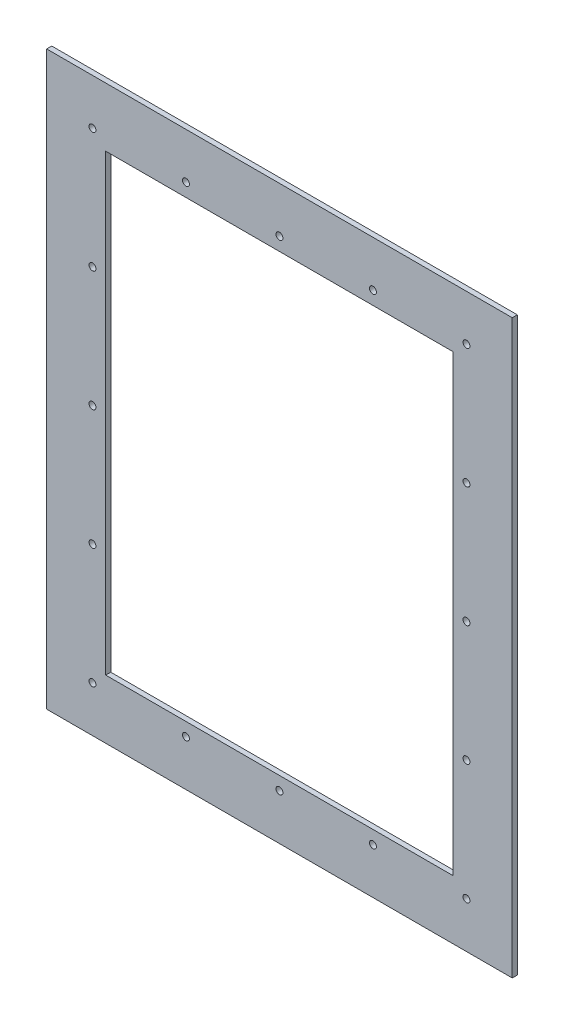
ISO-10303-21;
HEADER;
FILE_DESCRIPTION(('STEP AP214'),'2;1');
FILE_NAME('part.step','',(''),(''),'','','');
FILE_SCHEMA(('AUTOMOTIVE_DESIGN { 1 0 10303 214 1 1 1 1 }'));
ENDSEC;
DATA;
#1=APPLICATION_CONTEXT('core data for automotive mechanical design processes');
#2=APPLICATION_PROTOCOL_DEFINITION('international standard','automotive_design',2000,#1);
#3=PRODUCT_CONTEXT('',#1,'mechanical');
#4=PRODUCT('Part','Part','',(#3));
#5=PRODUCT_RELATED_PRODUCT_CATEGORY('part','',(#4));
#6=PRODUCT_DEFINITION_FORMATION('','',#4);
#7=PRODUCT_DEFINITION_CONTEXT('part definition',#1,'design');
#8=PRODUCT_DEFINITION('design','',#6,#7);
#9=PRODUCT_DEFINITION_SHAPE('','',#8);
#10=(LENGTH_UNIT() NAMED_UNIT(*) SI_UNIT(.MILLI.,.METRE.));
#11=(NAMED_UNIT(*) PLANE_ANGLE_UNIT() SI_UNIT($,.RADIAN.));
#12=(NAMED_UNIT(*) SI_UNIT($,.STERADIAN.) SOLID_ANGLE_UNIT());
#13=UNCERTAINTY_MEASURE_WITH_UNIT(LENGTH_MEASURE(1.E-05),#10,'distance_accuracy_value','');
#14=(GEOMETRIC_REPRESENTATION_CONTEXT(3) GLOBAL_UNCERTAINTY_ASSIGNED_CONTEXT((#13)) GLOBAL_UNIT_ASSIGNED_CONTEXT((#10,
#11,#12)) REPRESENTATION_CONTEXT('',''));
#15=CARTESIAN_POINT('',(0.,0.,0.));
#16=DIRECTION('',(0.,0.,1.));
#17=DIRECTION('',(1.,0.,0.));
#18=AXIS2_PLACEMENT_3D('',#15,#16,#17);
#19=CARTESIAN_POINT('',(0.,0.,3.));
#20=DIRECTION('',(0.,0.,1.));
#21=DIRECTION('',(1.,0.,0.));
#22=AXIS2_PLACEMENT_3D('',#19,#20,#21);
#23=PLANE('',#22);
#24=CARTESIAN_POINT('',(0.,-142.360879206864,3.));
#25=DIRECTION('',(0.,0.,1.));
#26=DIRECTION('',(-1.,0.,0.));
#27=AXIS2_PLACEMENT_3D('',#24,#25,#26);
#28=CIRCLE('',#27,2.05);
#29=CARTESIAN_POINT('',(-2.04999999999996,-142.360879206864,3.));
#30=VERTEX_POINT('',#29);
#31=EDGE_CURVE('E299',#30,#30,#28,.T.);
#32=ORIENTED_EDGE('',*,*,#31,.F.);
#33=EDGE_LOOP('',(#32));
#34=FACE_BOUND('',#33,.T.);
#35=CARTESIAN_POINT('',(110.860879206864,-71.1804396034318,3.));
#36=DIRECTION('',(0.,0.,1.));
#37=DIRECTION('',(1.,0.,0.));
#38=AXIS2_PLACEMENT_3D('',#35,#36,#37);
#39=CIRCLE('',#38,2.0499999999998);
#40=CARTESIAN_POINT('',(112.910879206864,-71.1804396034318,3.));
#41=VERTEX_POINT('',#40);
#42=EDGE_CURVE('E311',#41,#41,#39,.T.);
#43=ORIENTED_EDGE('',*,*,#42,.F.);
#44=EDGE_LOOP('',(#43));
#45=FACE_BOUND('',#44,.T.);
#46=CARTESIAN_POINT('',(55.4304396034319,-142.360879206864,3.));
#47=DIRECTION('',(0.,0.,1.));
#48=DIRECTION('',(1.,0.,0.));
#49=AXIS2_PLACEMENT_3D('',#46,#47,#48);
#50=CIRCLE('',#49,2.05000000000001);
#51=CARTESIAN_POINT('',(57.4804396034319,-142.360879206864,3.));
#52=VERTEX_POINT('',#51);
#53=EDGE_CURVE('E323',#52,#52,#50,.T.);
#54=ORIENTED_EDGE('',*,*,#53,.F.);
#55=EDGE_LOOP('',(#54));
#56=FACE_BOUND('',#55,.T.);
#57=CARTESIAN_POINT('',(110.860879206864,142.360879206864,3.));
#58=DIRECTION('',(0.,0.,1.));
#59=DIRECTION('',(-1.,0.,0.));
#60=AXIS2_PLACEMENT_3D('',#57,#58,#59);
#61=CIRCLE('',#60,2.0499999999998);
#62=CARTESIAN_POINT('',(108.810879206864,142.360879206864,3.));
#63=VERTEX_POINT('',#62);
#64=EDGE_CURVE('E335',#63,#63,#61,.T.);
#65=ORIENTED_EDGE('',*,*,#64,.F.);
#66=EDGE_LOOP('',(#65));
#67=FACE_BOUND('',#66,.T.);
#68=CARTESIAN_POINT('',(110.860879206864,0.,3.));
#69=DIRECTION('',(0.,0.,1.));
#70=DIRECTION('',(-1.,0.,0.));
#71=AXIS2_PLACEMENT_3D('',#68,#69,#70);
#72=CIRCLE('',#71,2.0499999999998);
#73=CARTESIAN_POINT('',(108.810879206864,0.,3.));
#74=VERTEX_POINT('',#73);
#75=EDGE_CURVE('E347',#74,#74,#72,.T.);
#76=ORIENTED_EDGE('',*,*,#75,.F.);
#77=EDGE_LOOP('',(#76));
#78=FACE_BOUND('',#77,.T.);
#79=CARTESIAN_POINT('',(-110.860879206864,-142.360879206864,3.));
#80=DIRECTION('',(0.,0.,1.));
#81=DIRECTION('',(-1.,0.,0.));
#82=AXIS2_PLACEMENT_3D('',#79,#80,#81);
#83=CIRCLE('',#82,2.0499999999998);
#84=CARTESIAN_POINT('',(-112.910879206863,-142.360879206864,3.));
#85=VERTEX_POINT('',#84);
#86=EDGE_CURVE('E359',#85,#85,#83,.T.);
#87=ORIENTED_EDGE('',*,*,#86,.F.);
#88=EDGE_LOOP('',(#87));
#89=FACE_BOUND('',#88,.T.);
#90=CARTESIAN_POINT('',(-110.860879206864,71.1804396034319,3.));
#91=DIRECTION('',(0.,0.,1.));
#92=DIRECTION('',(1.,0.,0.));
#93=AXIS2_PLACEMENT_3D('',#90,#91,#92);
#94=CIRCLE('',#93,2.0499999999998);
#95=CARTESIAN_POINT('',(-108.810879206864,71.1804396034319,3.));
#96=VERTEX_POINT('',#95);
#97=EDGE_CURVE('E371',#96,#96,#94,.T.);
#98=ORIENTED_EDGE('',*,*,#97,.F.);
#99=EDGE_LOOP('',(#98));
#100=FACE_BOUND('',#99,.T.);
#101=CARTESIAN_POINT('',(-110.860879206864,142.360879206864,3.));
#102=DIRECTION('',(0.,0.,1.));
#103=DIRECTION('',(1.,0.,0.));
#104=AXIS2_PLACEMENT_3D('',#101,#102,#103);
#105=CIRCLE('',#104,2.0499999999998);
#106=CARTESIAN_POINT('',(-108.810879206864,142.360879206864,3.));
#107=VERTEX_POINT('',#106);
#108=EDGE_CURVE('E133',#107,#107,#105,.T.);
#109=ORIENTED_EDGE('',*,*,#108,.F.);
#110=EDGE_LOOP('',(#109));
#111=FACE_BOUND('',#110,.T.);
#112=DIRECTION('',(0.,-1.,0.));
#113=VECTOR('',#112,1.);
#114=CARTESIAN_POINT('',(-138.,169.5,3.));
#115=LINE('',#114,#113);
#116=CARTESIAN_POINT('',(-138.,169.5,3.));
#117=VERTEX_POINT('',#116);
#118=CARTESIAN_POINT('',(-138.,-169.5,3.));
#119=VERTEX_POINT('',#118);
#120=EDGE_CURVE('E143',#117,#119,#115,.T.);
#121=ORIENTED_EDGE('',*,*,#120,.T.);
#122=DIRECTION('',(1.,0.,0.));
#123=VECTOR('',#122,1.);
#124=CARTESIAN_POINT('',(-138.,-169.5,3.));
#125=LINE('',#124,#123);
#126=CARTESIAN_POINT('',(138.,-169.5,3.));
#127=VERTEX_POINT('',#126);
#128=EDGE_CURVE('E146',#119,#127,#125,.T.);
#129=ORIENTED_EDGE('',*,*,#128,.T.);
#130=DIRECTION('',(0.,1.,0.));
#131=VECTOR('',#130,1.);
#132=CARTESIAN_POINT('',(138.,169.5,3.));
#133=LINE('',#132,#131);
#134=CARTESIAN_POINT('',(138.,169.5,3.));
#135=VERTEX_POINT('',#134);
#136=EDGE_CURVE('E149',#127,#135,#133,.T.);
#137=ORIENTED_EDGE('',*,*,#136,.T.);
#138=DIRECTION('',(-1.,0.,0.));
#139=VECTOR('',#138,1.);
#140=CARTESIAN_POINT('',(-138.,169.5,3.));
#141=LINE('',#140,#139);
#142=EDGE_CURVE('E151',#135,#117,#141,.T.);
#143=ORIENTED_EDGE('',*,*,#142,.T.);
#144=EDGE_LOOP('',(#121,#129,#137,#143));
#145=FACE_BOUND('',#144,.T.);
#146=DIRECTION('',(1.,0.,0.));
#147=VECTOR('',#146,1.);
#148=CARTESIAN_POINT('',(-103.,-134.5,3.));
#149=LINE('',#148,#147);
#150=CARTESIAN_POINT('',(-103.,-134.5,3.));
#151=VERTEX_POINT('',#150);
#152=CARTESIAN_POINT('',(103.,-134.5,3.));
#153=VERTEX_POINT('',#152);
#154=EDGE_CURVE('E112',#151,#153,#149,.T.);
#155=ORIENTED_EDGE('',*,*,#154,.F.);
#156=DIRECTION('',(0.,-1.,0.));
#157=VECTOR('',#156,1.);
#158=CARTESIAN_POINT('',(-103.,134.5,3.));
#159=LINE('',#158,#157);
#160=CARTESIAN_POINT('',(-103.,134.5,3.));
#161=VERTEX_POINT('',#160);
#162=EDGE_CURVE('E104',#161,#151,#159,.T.);
#163=ORIENTED_EDGE('',*,*,#162,.F.);
#164=DIRECTION('',(-1.,0.,0.));
#165=VECTOR('',#164,1.);
#166=CARTESIAN_POINT('',(-103.,134.5,3.));
#167=LINE('',#166,#165);
#168=CARTESIAN_POINT('',(103.,134.5,3.));
#169=VERTEX_POINT('',#168);
#170=EDGE_CURVE('E127',#169,#161,#167,.T.);
#171=ORIENTED_EDGE('',*,*,#170,.F.);
#172=DIRECTION('',(0.,1.,0.));
#173=VECTOR('',#172,1.);
#174=CARTESIAN_POINT('',(103.,134.5,3.));
#175=LINE('',#174,#173);
#176=EDGE_CURVE('E125',#153,#169,#175,.T.);
#177=ORIENTED_EDGE('',*,*,#176,.F.);
#178=EDGE_LOOP('',(#155,#163,#171,#177));
#179=FACE_BOUND('',#178,.T.);
#180=CARTESIAN_POINT('',(-55.4304396034318,142.360879206864,3.));
#181=DIRECTION('',(0.,0.,1.));
#182=DIRECTION('',(1.,0.,0.));
#183=AXIS2_PLACEMENT_3D('',#180,#181,#182);
#184=CIRCLE('',#183,2.05000000000001);
#185=CARTESIAN_POINT('',(-53.3804396034317,142.360879206864,3.));
#186=VERTEX_POINT('',#185);
#187=EDGE_CURVE('E377',#186,#186,#184,.T.);
#188=ORIENTED_EDGE('',*,*,#187,.F.);
#189=EDGE_LOOP('',(#188));
#190=FACE_BOUND('',#189,.T.);
#191=CARTESIAN_POINT('',(-55.4304396034317,-142.360879206864,3.));
#192=DIRECTION('',(0.,0.,1.));
#193=DIRECTION('',(-1.,0.,0.));
#194=AXIS2_PLACEMENT_3D('',#191,#192,#193);
#195=CIRCLE('',#194,2.05000000000001);
#196=CARTESIAN_POINT('',(-57.4804396034317,-142.360879206864,3.));
#197=VERTEX_POINT('',#196);
#198=EDGE_CURVE('E365',#197,#197,#195,.T.);
#199=ORIENTED_EDGE('',*,*,#198,.F.);
#200=EDGE_LOOP('',(#199));
#201=FACE_BOUND('',#200,.T.);
#202=CARTESIAN_POINT('',(-110.860879206864,-71.1804396034318,3.));
#203=DIRECTION('',(0.,0.,1.));
#204=DIRECTION('',(-1.,0.,0.));
#205=AXIS2_PLACEMENT_3D('',#202,#203,#204);
#206=CIRCLE('',#205,2.0499999999998);
#207=CARTESIAN_POINT('',(-112.910879206863,-71.1804396034318,3.));
#208=VERTEX_POINT('',#207);
#209=EDGE_CURVE('E353',#208,#208,#206,.T.);
#210=ORIENTED_EDGE('',*,*,#209,.F.);
#211=EDGE_LOOP('',(#210));
#212=FACE_BOUND('',#211,.T.);
#213=CARTESIAN_POINT('',(55.430439603432,142.360879206864,3.));
#214=DIRECTION('',(0.,0.,1.));
#215=DIRECTION('',(-1.,0.,0.));
#216=AXIS2_PLACEMENT_3D('',#213,#214,#215);
#217=CIRCLE('',#216,2.05000000000001);
#218=CARTESIAN_POINT('',(53.380439603432,142.360879206864,3.));
#219=VERTEX_POINT('',#218);
#220=EDGE_CURVE('E341',#219,#219,#217,.T.);
#221=ORIENTED_EDGE('',*,*,#220,.F.);
#222=EDGE_LOOP('',(#221));
#223=FACE_BOUND('',#222,.T.);
#224=CARTESIAN_POINT('',(110.860879206864,71.1804396034319,3.));
#225=DIRECTION('',(0.,0.,1.));
#226=DIRECTION('',(-1.,0.,0.));
#227=AXIS2_PLACEMENT_3D('',#224,#225,#226);
#228=CIRCLE('',#227,2.0499999999998);
#229=CARTESIAN_POINT('',(108.810879206864,71.1804396034319,3.));
#230=VERTEX_POINT('',#229);
#231=EDGE_CURVE('E329',#230,#230,#228,.T.);
#232=ORIENTED_EDGE('',*,*,#231,.F.);
#233=EDGE_LOOP('',(#232));
#234=FACE_BOUND('',#233,.T.);
#235=CARTESIAN_POINT('',(110.860879206864,-142.360879206864,3.));
#236=DIRECTION('',(0.,0.,1.));
#237=DIRECTION('',(1.,0.,0.));
#238=AXIS2_PLACEMENT_3D('',#235,#236,#237);
#239=CIRCLE('',#238,2.0499999999998);
#240=CARTESIAN_POINT('',(112.910879206864,-142.360879206864,3.));
#241=VERTEX_POINT('',#240);
#242=EDGE_CURVE('E317',#241,#241,#239,.T.);
#243=ORIENTED_EDGE('',*,*,#242,.F.);
#244=EDGE_LOOP('',(#243));
#245=FACE_BOUND('',#244,.T.);
#246=CARTESIAN_POINT('',(-110.860879206864,0.,3.));
#247=DIRECTION('',(0.,0.,1.));
#248=DIRECTION('',(1.,0.,0.));
#249=AXIS2_PLACEMENT_3D('',#246,#247,#248);
#250=CIRCLE('',#249,2.0499999999998);
#251=CARTESIAN_POINT('',(-108.810879206864,0.,3.));
#252=VERTEX_POINT('',#251);
#253=EDGE_CURVE('E305',#252,#252,#250,.T.);
#254=ORIENTED_EDGE('',*,*,#253,.F.);
#255=EDGE_LOOP('',(#254));
#256=FACE_BOUND('',#255,.T.);
#257=CARTESIAN_POINT('',(0.,142.360879206864,3.));
#258=DIRECTION('',(0.,0.,1.));
#259=DIRECTION('',(1.,0.,0.));
#260=AXIS2_PLACEMENT_3D('',#257,#258,#259);
#261=CIRCLE('',#260,2.05);
#262=CARTESIAN_POINT('',(2.05,142.360879206864,3.));
#263=VERTEX_POINT('',#262);
#264=EDGE_CURVE('E290',#263,#263,#261,.T.);
#265=ORIENTED_EDGE('',*,*,#264,.F.);
#266=EDGE_LOOP('',(#265));
#267=FACE_BOUND('',#266,.T.);
#268=ADVANCED_FACE('F39',(#34,#45,#56,#67,#78,#89,#100,#111,#145,#179,#190,#201,#212,#223,#234,
#245,#256,#267),#23,.T.);
#269=CARTESIAN_POINT('',(0.,0.,0.));
#270=DIRECTION('',(0.,0.,1.));
#271=DIRECTION('',(1.,0.,0.));
#272=AXIS2_PLACEMENT_3D('',#269,#270,#271);
#273=PLANE('',#272);
#274=DIRECTION('',(0.,-1.,0.));
#275=VECTOR('',#274,1.);
#276=CARTESIAN_POINT('',(-138.,169.5,0.));
#277=LINE('',#276,#275);
#278=CARTESIAN_POINT('',(-138.,169.5,0.));
#279=VERTEX_POINT('',#278);
#280=CARTESIAN_POINT('',(-138.,-169.5,0.));
#281=VERTEX_POINT('',#280);
#282=EDGE_CURVE('E120',#279,#281,#277,.T.);
#283=ORIENTED_EDGE('',*,*,#282,.F.);
#284=DIRECTION('',(-1.,0.,0.));
#285=VECTOR('',#284,1.);
#286=CARTESIAN_POINT('',(-138.,169.5,0.));
#287=LINE('',#286,#285);
#288=CARTESIAN_POINT('',(138.,169.5,0.));
#289=VERTEX_POINT('',#288);
#290=EDGE_CURVE('E147',#289,#279,#287,.T.);
#291=ORIENTED_EDGE('',*,*,#290,.F.);
#292=DIRECTION('',(0.,1.,0.));
#293=VECTOR('',#292,1.);
#294=CARTESIAN_POINT('',(138.,169.5,0.));
#295=LINE('',#294,#293);
#296=CARTESIAN_POINT('',(138.,-169.5,0.));
#297=VERTEX_POINT('',#296);
#298=EDGE_CURVE('E158',#297,#289,#295,.T.);
#299=ORIENTED_EDGE('',*,*,#298,.F.);
#300=DIRECTION('',(1.,0.,0.));
#301=VECTOR('',#300,1.);
#302=CARTESIAN_POINT('',(-138.,-169.5,0.));
#303=LINE('',#302,#301);
#304=EDGE_CURVE('E156',#281,#297,#303,.T.);
#305=ORIENTED_EDGE('',*,*,#304,.F.);
#306=EDGE_LOOP('',(#283,#291,#299,#305));
#307=FACE_BOUND('',#306,.T.);
#308=DIRECTION('',(0.,-1.,0.));
#309=VECTOR('',#308,1.);
#310=CARTESIAN_POINT('',(-103.,134.5,0.));
#311=LINE('',#310,#309);
#312=CARTESIAN_POINT('',(-103.,134.5,0.));
#313=VERTEX_POINT('',#312);
#314=CARTESIAN_POINT('',(-103.,-134.5,0.));
#315=VERTEX_POINT('',#314);
#316=EDGE_CURVE('E62',#313,#315,#311,.T.);
#317=ORIENTED_EDGE('',*,*,#316,.T.);
#318=DIRECTION('',(1.,0.,0.));
#319=VECTOR('',#318,1.);
#320=CARTESIAN_POINT('',(-103.,-134.5,0.));
#321=LINE('',#320,#319);
#322=CARTESIAN_POINT('',(103.,-134.5,0.));
#323=VERTEX_POINT('',#322);
#324=EDGE_CURVE('E119',#315,#323,#321,.T.);
#325=ORIENTED_EDGE('',*,*,#324,.T.);
#326=DIRECTION('',(0.,1.,0.));
#327=VECTOR('',#326,1.);
#328=CARTESIAN_POINT('',(103.,134.5,0.));
#329=LINE('',#328,#327);
#330=CARTESIAN_POINT('',(103.,134.5,0.));
#331=VERTEX_POINT('',#330);
#332=EDGE_CURVE('E135',#323,#331,#329,.T.);
#333=ORIENTED_EDGE('',*,*,#332,.T.);
#334=DIRECTION('',(-1.,0.,0.));
#335=VECTOR('',#334,1.);
#336=CARTESIAN_POINT('',(-103.,134.5,0.));
#337=LINE('',#336,#335);
#338=EDGE_CURVE('E113',#331,#313,#337,.T.);
#339=ORIENTED_EDGE('',*,*,#338,.T.);
#340=EDGE_LOOP('',(#317,#325,#333,#339));
#341=FACE_BOUND('',#340,.T.);
#342=CARTESIAN_POINT('',(-110.860879206864,142.360879206864,0.));
#343=DIRECTION('',(0.,0.,1.));
#344=DIRECTION('',(1.,0.,0.));
#345=AXIS2_PLACEMENT_3D('',#342,#343,#344);
#346=CIRCLE('',#345,2.0499999999998);
#347=CARTESIAN_POINT('',(-108.810879206864,142.360879206864,0.));
#348=VERTEX_POINT('',#347);
#349=EDGE_CURVE('E380',#348,#348,#346,.T.);
#350=ORIENTED_EDGE('',*,*,#349,.T.);
#351=EDGE_LOOP('',(#350));
#352=FACE_BOUND('',#351,.T.);
#353=CARTESIAN_POINT('',(-55.4304396034318,142.360879206864,0.));
#354=DIRECTION('',(0.,0.,1.));
#355=DIRECTION('',(1.,0.,0.));
#356=AXIS2_PLACEMENT_3D('',#353,#354,#355);
#357=CIRCLE('',#356,2.05000000000001);
#358=CARTESIAN_POINT('',(-53.3804396034317,142.360879206864,0.));
#359=VERTEX_POINT('',#358);
#360=EDGE_CURVE('E374',#359,#359,#357,.T.);
#361=ORIENTED_EDGE('',*,*,#360,.T.);
#362=EDGE_LOOP('',(#361));
#363=FACE_BOUND('',#362,.T.);
#364=CARTESIAN_POINT('',(-110.860879206864,71.1804396034319,0.));
#365=DIRECTION('',(0.,0.,1.));
#366=DIRECTION('',(1.,0.,0.));
#367=AXIS2_PLACEMENT_3D('',#364,#365,#366);
#368=CIRCLE('',#367,2.0499999999998);
#369=CARTESIAN_POINT('',(-108.810879206864,71.1804396034319,0.));
#370=VERTEX_POINT('',#369);
#371=EDGE_CURVE('E368',#370,#370,#368,.T.);
#372=ORIENTED_EDGE('',*,*,#371,.T.);
#373=EDGE_LOOP('',(#372));
#374=FACE_BOUND('',#373,.T.);
#375=CARTESIAN_POINT('',(-55.4304396034317,-142.360879206864,0.));
#376=DIRECTION('',(0.,0.,1.));
#377=DIRECTION('',(-1.,0.,0.));
#378=AXIS2_PLACEMENT_3D('',#375,#376,#377);
#379=CIRCLE('',#378,2.05000000000001);
#380=CARTESIAN_POINT('',(-57.4804396034317,-142.360879206864,0.));
#381=VERTEX_POINT('',#380);
#382=EDGE_CURVE('E362',#381,#381,#379,.T.);
#383=ORIENTED_EDGE('',*,*,#382,.T.);
#384=EDGE_LOOP('',(#383));
#385=FACE_BOUND('',#384,.T.);
#386=CARTESIAN_POINT('',(-110.860879206864,-142.360879206864,0.));
#387=DIRECTION('',(0.,0.,1.));
#388=DIRECTION('',(-1.,0.,0.));
#389=AXIS2_PLACEMENT_3D('',#386,#387,#388);
#390=CIRCLE('',#389,2.0499999999998);
#391=CARTESIAN_POINT('',(-112.910879206863,-142.360879206864,0.));
#392=VERTEX_POINT('',#391);
#393=EDGE_CURVE('E356',#392,#392,#390,.T.);
#394=ORIENTED_EDGE('',*,*,#393,.T.);
#395=EDGE_LOOP('',(#394));
#396=FACE_BOUND('',#395,.T.);
#397=CARTESIAN_POINT('',(-110.860879206864,-71.1804396034318,0.));
#398=DIRECTION('',(0.,0.,1.));
#399=DIRECTION('',(-1.,0.,0.));
#400=AXIS2_PLACEMENT_3D('',#397,#398,#399);
#401=CIRCLE('',#400,2.0499999999998);
#402=CARTESIAN_POINT('',(-112.910879206863,-71.1804396034318,0.));
#403=VERTEX_POINT('',#402);
#404=EDGE_CURVE('E350',#403,#403,#401,.T.);
#405=ORIENTED_EDGE('',*,*,#404,.T.);
#406=EDGE_LOOP('',(#405));
#407=FACE_BOUND('',#406,.T.);
#408=CARTESIAN_POINT('',(110.860879206864,0.,0.));
#409=DIRECTION('',(0.,0.,1.));
#410=DIRECTION('',(-1.,0.,0.));
#411=AXIS2_PLACEMENT_3D('',#408,#409,#410);
#412=CIRCLE('',#411,2.0499999999998);
#413=CARTESIAN_POINT('',(108.810879206864,0.,0.));
#414=VERTEX_POINT('',#413);
#415=EDGE_CURVE('E344',#414,#414,#412,.T.);
#416=ORIENTED_EDGE('',*,*,#415,.T.);
#417=EDGE_LOOP('',(#416));
#418=FACE_BOUND('',#417,.T.);
#419=CARTESIAN_POINT('',(55.430439603432,142.360879206864,0.));
#420=DIRECTION('',(0.,0.,1.));
#421=DIRECTION('',(-1.,0.,0.));
#422=AXIS2_PLACEMENT_3D('',#419,#420,#421);
#423=CIRCLE('',#422,2.05000000000001);
#424=CARTESIAN_POINT('',(53.380439603432,142.360879206864,0.));
#425=VERTEX_POINT('',#424);
#426=EDGE_CURVE('E338',#425,#425,#423,.T.);
#427=ORIENTED_EDGE('',*,*,#426,.T.);
#428=EDGE_LOOP('',(#427));
#429=FACE_BOUND('',#428,.T.);
#430=CARTESIAN_POINT('',(110.860879206864,142.360879206864,0.));
#431=DIRECTION('',(0.,0.,1.));
#432=DIRECTION('',(-1.,0.,0.));
#433=AXIS2_PLACEMENT_3D('',#430,#431,#432);
#434=CIRCLE('',#433,2.0499999999998);
#435=CARTESIAN_POINT('',(108.810879206864,142.360879206864,0.));
#436=VERTEX_POINT('',#435);
#437=EDGE_CURVE('E332',#436,#436,#434,.T.);
#438=ORIENTED_EDGE('',*,*,#437,.T.);
#439=EDGE_LOOP('',(#438));
#440=FACE_BOUND('',#439,.T.);
#441=CARTESIAN_POINT('',(110.860879206864,71.1804396034319,0.));
#442=DIRECTION('',(0.,0.,1.));
#443=DIRECTION('',(-1.,0.,0.));
#444=AXIS2_PLACEMENT_3D('',#441,#442,#443);
#445=CIRCLE('',#444,2.0499999999998);
#446=CARTESIAN_POINT('',(108.810879206864,71.1804396034319,0.));
#447=VERTEX_POINT('',#446);
#448=EDGE_CURVE('E326',#447,#447,#445,.T.);
#449=ORIENTED_EDGE('',*,*,#448,.T.);
#450=EDGE_LOOP('',(#449));
#451=FACE_BOUND('',#450,.T.);
#452=CARTESIAN_POINT('',(55.4304396034319,-142.360879206864,0.));
#453=DIRECTION('',(0.,0.,1.));
#454=DIRECTION('',(1.,0.,0.));
#455=AXIS2_PLACEMENT_3D('',#452,#453,#454);
#456=CIRCLE('',#455,2.05000000000001);
#457=CARTESIAN_POINT('',(57.4804396034319,-142.360879206864,0.));
#458=VERTEX_POINT('',#457);
#459=EDGE_CURVE('E320',#458,#458,#456,.T.);
#460=ORIENTED_EDGE('',*,*,#459,.T.);
#461=EDGE_LOOP('',(#460));
#462=FACE_BOUND('',#461,.T.);
#463=CARTESIAN_POINT('',(110.860879206864,-142.360879206864,0.));
#464=DIRECTION('',(0.,0.,1.));
#465=DIRECTION('',(1.,0.,0.));
#466=AXIS2_PLACEMENT_3D('',#463,#464,#465);
#467=CIRCLE('',#466,2.0499999999998);
#468=CARTESIAN_POINT('',(112.910879206864,-142.360879206864,0.));
#469=VERTEX_POINT('',#468);
#470=EDGE_CURVE('E314',#469,#469,#467,.T.);
#471=ORIENTED_EDGE('',*,*,#470,.T.);
#472=EDGE_LOOP('',(#471));
#473=FACE_BOUND('',#472,.T.);
#474=CARTESIAN_POINT('',(110.860879206864,-71.1804396034318,0.));
#475=DIRECTION('',(0.,0.,1.));
#476=DIRECTION('',(1.,0.,0.));
#477=AXIS2_PLACEMENT_3D('',#474,#475,#476);
#478=CIRCLE('',#477,2.0499999999998);
#479=CARTESIAN_POINT('',(112.910879206864,-71.1804396034318,0.));
#480=VERTEX_POINT('',#479);
#481=EDGE_CURVE('E308',#480,#480,#478,.T.);
#482=ORIENTED_EDGE('',*,*,#481,.T.);
#483=EDGE_LOOP('',(#482));
#484=FACE_BOUND('',#483,.T.);
#485=CARTESIAN_POINT('',(-110.860879206864,0.,0.));
#486=DIRECTION('',(0.,0.,1.));
#487=DIRECTION('',(1.,0.,0.));
#488=AXIS2_PLACEMENT_3D('',#485,#486,#487);
#489=CIRCLE('',#488,2.0499999999998);
#490=CARTESIAN_POINT('',(-108.810879206864,0.,0.));
#491=VERTEX_POINT('',#490);
#492=EDGE_CURVE('E302',#491,#491,#489,.T.);
#493=ORIENTED_EDGE('',*,*,#492,.T.);
#494=EDGE_LOOP('',(#493));
#495=FACE_BOUND('',#494,.T.);
#496=CARTESIAN_POINT('',(0.,-142.360879206864,0.));
#497=DIRECTION('',(0.,0.,1.));
#498=DIRECTION('',(-1.,0.,0.));
#499=AXIS2_PLACEMENT_3D('',#496,#497,#498);
#500=CIRCLE('',#499,2.05);
#501=CARTESIAN_POINT('',(-2.04999999999996,-142.360879206864,0.));
#502=VERTEX_POINT('',#501);
#503=EDGE_CURVE('E296',#502,#502,#500,.T.);
#504=ORIENTED_EDGE('',*,*,#503,.T.);
#505=EDGE_LOOP('',(#504));
#506=FACE_BOUND('',#505,.T.);
#507=CARTESIAN_POINT('',(0.,142.360879206864,0.));
#508=DIRECTION('',(0.,0.,1.));
#509=DIRECTION('',(1.,0.,0.));
#510=AXIS2_PLACEMENT_3D('',#507,#508,#509);
#511=CIRCLE('',#510,2.05);
#512=CARTESIAN_POINT('',(2.05,142.360879206864,0.));
#513=VERTEX_POINT('',#512);
#514=EDGE_CURVE('E293',#513,#513,#511,.T.);
#515=ORIENTED_EDGE('',*,*,#514,.T.);
#516=EDGE_LOOP('',(#515));
#517=FACE_BOUND('',#516,.T.);
#518=ADVANCED_FACE('F176',(#307,#341,#352,#363,#374,#385,#396,#407,#418,#429,#440,#451,#462,
#473,#484,#495,#506,#517),#273,.F.);
#519=CARTESIAN_POINT('',(-138.,169.5,3.));
#520=DIRECTION('',(1.,0.,0.));
#521=DIRECTION('',(0.,1.,0.));
#522=AXIS2_PLACEMENT_3D('',#519,#520,#521);
#523=PLANE('',#522);
#524=ORIENTED_EDGE('',*,*,#282,.T.);
#525=DIRECTION('',(0.,0.,-1.));
#526=VECTOR('',#525,1.);
#527=CARTESIAN_POINT('',(-138.,-169.5,3.));
#528=LINE('',#527,#526);
#529=EDGE_CURVE('E11',#119,#281,#528,.T.);
#530=ORIENTED_EDGE('',*,*,#529,.F.);
#531=ORIENTED_EDGE('',*,*,#120,.F.);
#532=DIRECTION('',(0.,0.,-1.));
#533=VECTOR('',#532,1.);
#534=CARTESIAN_POINT('',(-138.,169.5,3.));
#535=LINE('',#534,#533);
#536=EDGE_CURVE('E153',#117,#279,#535,.T.);
#537=ORIENTED_EDGE('',*,*,#536,.T.);
#538=EDGE_LOOP('',(#524,#530,#531,#537));
#539=FACE_BOUND('',#538,.T.);
#540=ADVANCED_FACE('F41',(#539),#523,.F.);
#541=CARTESIAN_POINT('',(-138.,-169.5,3.));
#542=DIRECTION('',(0.,1.,0.));
#543=DIRECTION('',(0.,0.,1.));
#544=AXIS2_PLACEMENT_3D('',#541,#542,#543);
#545=PLANE('',#544);
#546=ORIENTED_EDGE('',*,*,#304,.T.);
#547=DIRECTION('',(0.,0.,-1.));
#548=VECTOR('',#547,1.);
#549=CARTESIAN_POINT('',(138.,-169.5,3.));
#550=LINE('',#549,#548);
#551=EDGE_CURVE('E47',#127,#297,#550,.T.);
#552=ORIENTED_EDGE('',*,*,#551,.F.);
#553=ORIENTED_EDGE('',*,*,#128,.F.);
#554=ORIENTED_EDGE('',*,*,#529,.T.);
#555=EDGE_LOOP('',(#546,#552,#553,#554));
#556=FACE_BOUND('',#555,.T.);
#557=ADVANCED_FACE('F186',(#556),#545,.F.);
#558=CARTESIAN_POINT('',(138.,169.5,3.));
#559=DIRECTION('',(-1.,0.,0.));
#560=DIRECTION('',(0.,0.,1.));
#561=AXIS2_PLACEMENT_3D('',#558,#559,#560);
#562=PLANE('',#561);
#563=ORIENTED_EDGE('',*,*,#298,.T.);
#564=DIRECTION('',(0.,0.,-1.));
#565=VECTOR('',#564,1.);
#566=CARTESIAN_POINT('',(138.,169.5,3.));
#567=LINE('',#566,#565);
#568=EDGE_CURVE('E163',#135,#289,#567,.T.);
#569=ORIENTED_EDGE('',*,*,#568,.F.);
#570=ORIENTED_EDGE('',*,*,#136,.F.);
#571=ORIENTED_EDGE('',*,*,#551,.T.);
#572=EDGE_LOOP('',(#563,#569,#570,#571));
#573=FACE_BOUND('',#572,.T.);
#574=ADVANCED_FACE('F170',(#573),#562,.F.);
#575=CARTESIAN_POINT('',(-138.,169.5,3.));
#576=DIRECTION('',(0.,-1.,0.));
#577=DIRECTION('',(0.,0.,-1.));
#578=AXIS2_PLACEMENT_3D('',#575,#576,#577);
#579=PLANE('',#578);
#580=ORIENTED_EDGE('',*,*,#290,.T.);
#581=ORIENTED_EDGE('',*,*,#536,.F.);
#582=ORIENTED_EDGE('',*,*,#142,.F.);
#583=ORIENTED_EDGE('',*,*,#568,.T.);
#584=EDGE_LOOP('',(#580,#581,#582,#583));
#585=FACE_BOUND('',#584,.T.);
#586=ADVANCED_FACE('F180',(#585),#579,.F.);
#587=CARTESIAN_POINT('',(-103.,134.5,3.));
#588=DIRECTION('',(1.,0.,0.));
#589=DIRECTION('',(0.,0.,-1.));
#590=AXIS2_PLACEMENT_3D('',#587,#588,#589);
#591=PLANE('',#590);
#592=ORIENTED_EDGE('',*,*,#316,.F.);
#593=DIRECTION('',(0.,0.,-1.));
#594=VECTOR('',#593,1.);
#595=CARTESIAN_POINT('',(-103.,134.5,3.));
#596=LINE('',#595,#594);
#597=EDGE_CURVE('E108',#161,#313,#596,.T.);
#598=ORIENTED_EDGE('',*,*,#597,.F.);
#599=ORIENTED_EDGE('',*,*,#162,.T.);
#600=DIRECTION('',(0.,0.,-1.));
#601=VECTOR('',#600,1.);
#602=CARTESIAN_POINT('',(-103.,-134.5,3.));
#603=LINE('',#602,#601);
#604=EDGE_CURVE('E107',#151,#315,#603,.T.);
#605=ORIENTED_EDGE('',*,*,#604,.T.);
#606=EDGE_LOOP('',(#592,#598,#599,#605));
#607=FACE_BOUND('',#606,.T.);
#608=ADVANCED_FACE('F106',(#607),#591,.T.);
#609=CARTESIAN_POINT('',(-103.,-134.5,3.));
#610=DIRECTION('',(0.,1.,0.));
#611=DIRECTION('',(-1.,0.,0.));
#612=AXIS2_PLACEMENT_3D('',#609,#610,#611);
#613=PLANE('',#612);
#614=ORIENTED_EDGE('',*,*,#324,.F.);
#615=ORIENTED_EDGE('',*,*,#604,.F.);
#616=ORIENTED_EDGE('',*,*,#154,.T.);
#617=DIRECTION('',(0.,0.,-1.));
#618=VECTOR('',#617,1.);
#619=CARTESIAN_POINT('',(103.,-134.5,3.));
#620=LINE('',#619,#618);
#621=EDGE_CURVE('E121',#153,#323,#620,.T.);
#622=ORIENTED_EDGE('',*,*,#621,.T.);
#623=EDGE_LOOP('',(#614,#615,#616,#622));
#624=FACE_BOUND('',#623,.T.);
#625=ADVANCED_FACE('F116',(#624),#613,.T.);
#626=CARTESIAN_POINT('',(103.,134.5,3.));
#627=DIRECTION('',(-1.,0.,0.));
#628=DIRECTION('',(0.,0.,1.));
#629=AXIS2_PLACEMENT_3D('',#626,#627,#628);
#630=PLANE('',#629);
#631=ORIENTED_EDGE('',*,*,#332,.F.);
#632=ORIENTED_EDGE('',*,*,#621,.F.);
#633=ORIENTED_EDGE('',*,*,#176,.T.);
#634=DIRECTION('',(0.,0.,-1.));
#635=VECTOR('',#634,1.);
#636=CARTESIAN_POINT('',(103.,134.5,3.));
#637=LINE('',#636,#635);
#638=EDGE_CURVE('E54',#169,#331,#637,.T.);
#639=ORIENTED_EDGE('',*,*,#638,.T.);
#640=EDGE_LOOP('',(#631,#632,#633,#639));
#641=FACE_BOUND('',#640,.T.);
#642=ADVANCED_FACE('F212',(#641),#630,.T.);
#643=CARTESIAN_POINT('',(-103.,134.5,3.));
#644=DIRECTION('',(0.,-1.,0.));
#645=DIRECTION('',(1.,0.,0.));
#646=AXIS2_PLACEMENT_3D('',#643,#644,#645);
#647=PLANE('',#646);
#648=ORIENTED_EDGE('',*,*,#338,.F.);
#649=ORIENTED_EDGE('',*,*,#638,.F.);
#650=ORIENTED_EDGE('',*,*,#170,.T.);
#651=ORIENTED_EDGE('',*,*,#597,.T.);
#652=EDGE_LOOP('',(#648,#649,#650,#651));
#653=FACE_BOUND('',#652,.T.);
#654=ADVANCED_FACE('F216',(#653),#647,.T.);
#655=CARTESIAN_POINT('',(-110.860879206864,142.360879206864,3.));
#656=DIRECTION('',(0.,0.,-1.));
#657=DIRECTION('',(-1.,0.,0.));
#658=AXIS2_PLACEMENT_3D('',#655,#656,#657);
#659=CYLINDRICAL_SURFACE('',#658,2.0499999999998);
#660=ORIENTED_EDGE('',*,*,#108,.T.);
#661=EDGE_LOOP('',(#660));
#662=FACE_BOUND('',#661,.T.);
#663=ORIENTED_EDGE('',*,*,#349,.F.);
#664=EDGE_LOOP('',(#663));
#665=FACE_BOUND('',#664,.T.);
#666=ADVANCED_FACE('F222',(#662,#665),#659,.F.);
#667=CARTESIAN_POINT('',(-55.4304396034318,142.360879206864,3.));
#668=DIRECTION('',(0.,0.,-1.));
#669=DIRECTION('',(-1.,0.,0.));
#670=AXIS2_PLACEMENT_3D('',#667,#668,#669);
#671=CYLINDRICAL_SURFACE('',#670,2.05000000000001);
#672=ORIENTED_EDGE('',*,*,#187,.T.);
#673=EDGE_LOOP('',(#672));
#674=FACE_BOUND('',#673,.T.);
#675=ORIENTED_EDGE('',*,*,#360,.F.);
#676=EDGE_LOOP('',(#675));
#677=FACE_BOUND('',#676,.T.);
#678=ADVANCED_FACE('F225',(#674,#677),#671,.F.);
#679=CARTESIAN_POINT('',(-110.860879206864,71.1804396034319,3.));
#680=DIRECTION('',(0.,0.,-1.));
#681=DIRECTION('',(-1.,0.,0.));
#682=AXIS2_PLACEMENT_3D('',#679,#680,#681);
#683=CYLINDRICAL_SURFACE('',#682,2.0499999999998);
#684=ORIENTED_EDGE('',*,*,#97,.T.);
#685=EDGE_LOOP('',(#684));
#686=FACE_BOUND('',#685,.T.);
#687=ORIENTED_EDGE('',*,*,#371,.F.);
#688=EDGE_LOOP('',(#687));
#689=FACE_BOUND('',#688,.T.);
#690=ADVANCED_FACE('F229',(#686,#689),#683,.F.);
#691=CARTESIAN_POINT('',(-55.4304396034317,-142.360879206864,3.));
#692=DIRECTION('',(0.,0.,-1.));
#693=DIRECTION('',(-1.,0.,0.));
#694=AXIS2_PLACEMENT_3D('',#691,#692,#693);
#695=CYLINDRICAL_SURFACE('',#694,2.05000000000001);
#696=ORIENTED_EDGE('',*,*,#198,.T.);
#697=EDGE_LOOP('',(#696));
#698=FACE_BOUND('',#697,.T.);
#699=ORIENTED_EDGE('',*,*,#382,.F.);
#700=EDGE_LOOP('',(#699));
#701=FACE_BOUND('',#700,.T.);
#702=ADVANCED_FACE('F233',(#698,#701),#695,.F.);
#703=CARTESIAN_POINT('',(-110.860879206864,-142.360879206864,3.));
#704=DIRECTION('',(0.,0.,-1.));
#705=DIRECTION('',(-1.,0.,0.));
#706=AXIS2_PLACEMENT_3D('',#703,#704,#705);
#707=CYLINDRICAL_SURFACE('',#706,2.0499999999998);
#708=ORIENTED_EDGE('',*,*,#86,.T.);
#709=EDGE_LOOP('',(#708));
#710=FACE_BOUND('',#709,.T.);
#711=ORIENTED_EDGE('',*,*,#393,.F.);
#712=EDGE_LOOP('',(#711));
#713=FACE_BOUND('',#712,.T.);
#714=ADVANCED_FACE('F237',(#710,#713),#707,.F.);
#715=CARTESIAN_POINT('',(-110.860879206864,-71.1804396034318,3.));
#716=DIRECTION('',(0.,0.,-1.));
#717=DIRECTION('',(-1.,0.,0.));
#718=AXIS2_PLACEMENT_3D('',#715,#716,#717);
#719=CYLINDRICAL_SURFACE('',#718,2.0499999999998);
#720=ORIENTED_EDGE('',*,*,#209,.T.);
#721=EDGE_LOOP('',(#720));
#722=FACE_BOUND('',#721,.T.);
#723=ORIENTED_EDGE('',*,*,#404,.F.);
#724=EDGE_LOOP('',(#723));
#725=FACE_BOUND('',#724,.T.);
#726=ADVANCED_FACE('F241',(#722,#725),#719,.F.);
#727=CARTESIAN_POINT('',(110.860879206864,0.,3.));
#728=DIRECTION('',(0.,0.,-1.));
#729=DIRECTION('',(-1.,0.,0.));
#730=AXIS2_PLACEMENT_3D('',#727,#728,#729);
#731=CYLINDRICAL_SURFACE('',#730,2.0499999999998);
#732=ORIENTED_EDGE('',*,*,#75,.T.);
#733=EDGE_LOOP('',(#732));
#734=FACE_BOUND('',#733,.T.);
#735=ORIENTED_EDGE('',*,*,#415,.F.);
#736=EDGE_LOOP('',(#735));
#737=FACE_BOUND('',#736,.T.);
#738=ADVANCED_FACE('F245',(#734,#737),#731,.F.);
#739=CARTESIAN_POINT('',(55.430439603432,142.360879206864,3.));
#740=DIRECTION('',(0.,0.,-1.));
#741=DIRECTION('',(-1.,0.,0.));
#742=AXIS2_PLACEMENT_3D('',#739,#740,#741);
#743=CYLINDRICAL_SURFACE('',#742,2.05000000000001);
#744=ORIENTED_EDGE('',*,*,#220,.T.);
#745=EDGE_LOOP('',(#744));
#746=FACE_BOUND('',#745,.T.);
#747=ORIENTED_EDGE('',*,*,#426,.F.);
#748=EDGE_LOOP('',(#747));
#749=FACE_BOUND('',#748,.T.);
#750=ADVANCED_FACE('F249',(#746,#749),#743,.F.);
#751=CARTESIAN_POINT('',(110.860879206864,142.360879206864,3.));
#752=DIRECTION('',(0.,0.,-1.));
#753=DIRECTION('',(-1.,0.,0.));
#754=AXIS2_PLACEMENT_3D('',#751,#752,#753);
#755=CYLINDRICAL_SURFACE('',#754,2.0499999999998);
#756=ORIENTED_EDGE('',*,*,#64,.T.);
#757=EDGE_LOOP('',(#756));
#758=FACE_BOUND('',#757,.T.);
#759=ORIENTED_EDGE('',*,*,#437,.F.);
#760=EDGE_LOOP('',(#759));
#761=FACE_BOUND('',#760,.T.);
#762=ADVANCED_FACE('F253',(#758,#761),#755,.F.);
#763=CARTESIAN_POINT('',(110.860879206864,71.1804396034319,3.));
#764=DIRECTION('',(0.,0.,-1.));
#765=DIRECTION('',(-1.,0.,0.));
#766=AXIS2_PLACEMENT_3D('',#763,#764,#765);
#767=CYLINDRICAL_SURFACE('',#766,2.0499999999998);
#768=ORIENTED_EDGE('',*,*,#231,.T.);
#769=EDGE_LOOP('',(#768));
#770=FACE_BOUND('',#769,.T.);
#771=ORIENTED_EDGE('',*,*,#448,.F.);
#772=EDGE_LOOP('',(#771));
#773=FACE_BOUND('',#772,.T.);
#774=ADVANCED_FACE('F257',(#770,#773),#767,.F.);
#775=CARTESIAN_POINT('',(55.4304396034319,-142.360879206864,3.));
#776=DIRECTION('',(0.,0.,-1.));
#777=DIRECTION('',(-1.,0.,0.));
#778=AXIS2_PLACEMENT_3D('',#775,#776,#777);
#779=CYLINDRICAL_SURFACE('',#778,2.05000000000001);
#780=ORIENTED_EDGE('',*,*,#53,.T.);
#781=EDGE_LOOP('',(#780));
#782=FACE_BOUND('',#781,.T.);
#783=ORIENTED_EDGE('',*,*,#459,.F.);
#784=EDGE_LOOP('',(#783));
#785=FACE_BOUND('',#784,.T.);
#786=ADVANCED_FACE('F261',(#782,#785),#779,.F.);
#787=CARTESIAN_POINT('',(110.860879206864,-142.360879206864,3.));
#788=DIRECTION('',(0.,0.,-1.));
#789=DIRECTION('',(-1.,0.,0.));
#790=AXIS2_PLACEMENT_3D('',#787,#788,#789);
#791=CYLINDRICAL_SURFACE('',#790,2.0499999999998);
#792=ORIENTED_EDGE('',*,*,#242,.T.);
#793=EDGE_LOOP('',(#792));
#794=FACE_BOUND('',#793,.T.);
#795=ORIENTED_EDGE('',*,*,#470,.F.);
#796=EDGE_LOOP('',(#795));
#797=FACE_BOUND('',#796,.T.);
#798=ADVANCED_FACE('F265',(#794,#797),#791,.F.);
#799=CARTESIAN_POINT('',(110.860879206864,-71.1804396034318,3.));
#800=DIRECTION('',(0.,0.,-1.));
#801=DIRECTION('',(-1.,0.,0.));
#802=AXIS2_PLACEMENT_3D('',#799,#800,#801);
#803=CYLINDRICAL_SURFACE('',#802,2.0499999999998);
#804=ORIENTED_EDGE('',*,*,#42,.T.);
#805=EDGE_LOOP('',(#804));
#806=FACE_BOUND('',#805,.T.);
#807=ORIENTED_EDGE('',*,*,#481,.F.);
#808=EDGE_LOOP('',(#807));
#809=FACE_BOUND('',#808,.T.);
#810=ADVANCED_FACE('F269',(#806,#809),#803,.F.);
#811=CARTESIAN_POINT('',(-110.860879206864,0.,3.));
#812=DIRECTION('',(0.,0.,-1.));
#813=DIRECTION('',(-1.,0.,0.));
#814=AXIS2_PLACEMENT_3D('',#811,#812,#813);
#815=CYLINDRICAL_SURFACE('',#814,2.0499999999998);
#816=ORIENTED_EDGE('',*,*,#253,.T.);
#817=EDGE_LOOP('',(#816));
#818=FACE_BOUND('',#817,.T.);
#819=ORIENTED_EDGE('',*,*,#492,.F.);
#820=EDGE_LOOP('',(#819));
#821=FACE_BOUND('',#820,.T.);
#822=ADVANCED_FACE('F273',(#818,#821),#815,.F.);
#823=CARTESIAN_POINT('',(0.,-142.360879206864,3.));
#824=DIRECTION('',(0.,0.,-1.));
#825=DIRECTION('',(-1.,0.,0.));
#826=AXIS2_PLACEMENT_3D('',#823,#824,#825);
#827=CYLINDRICAL_SURFACE('',#826,2.05);
#828=ORIENTED_EDGE('',*,*,#31,.T.);
#829=EDGE_LOOP('',(#828));
#830=FACE_BOUND('',#829,.T.);
#831=ORIENTED_EDGE('',*,*,#503,.F.);
#832=EDGE_LOOP('',(#831));
#833=FACE_BOUND('',#832,.T.);
#834=ADVANCED_FACE('F277',(#830,#833),#827,.F.);
#835=CARTESIAN_POINT('',(0.,142.360879206864,3.));
#836=DIRECTION('',(0.,0.,-1.));
#837=DIRECTION('',(-1.,0.,0.));
#838=AXIS2_PLACEMENT_3D('',#835,#836,#837);
#839=CYLINDRICAL_SURFACE('',#838,2.05);
#840=ORIENTED_EDGE('',*,*,#264,.T.);
#841=EDGE_LOOP('',(#840));
#842=FACE_BOUND('',#841,.T.);
#843=ORIENTED_EDGE('',*,*,#514,.F.);
#844=EDGE_LOOP('',(#843));
#845=FACE_BOUND('',#844,.T.);
#846=ADVANCED_FACE('F281',(#842,#845),#839,.F.);
#847=CLOSED_SHELL('',(#268,#518,#540,#557,#574,#586,#608,#625,#642,#654,#666,#678,#690,#702,
#714,#726,#738,#750,#762,#774,#786,#798,#810,#822,#834,#846));
#848=MANIFOLD_SOLID_BREP('B2',#847);
#849=ADVANCED_BREP_SHAPE_REPRESENTATION('',(#18,#848),#14);
#850=SHAPE_DEFINITION_REPRESENTATION(#9,#849);
ENDSEC;
END-ISO-10303-21;
